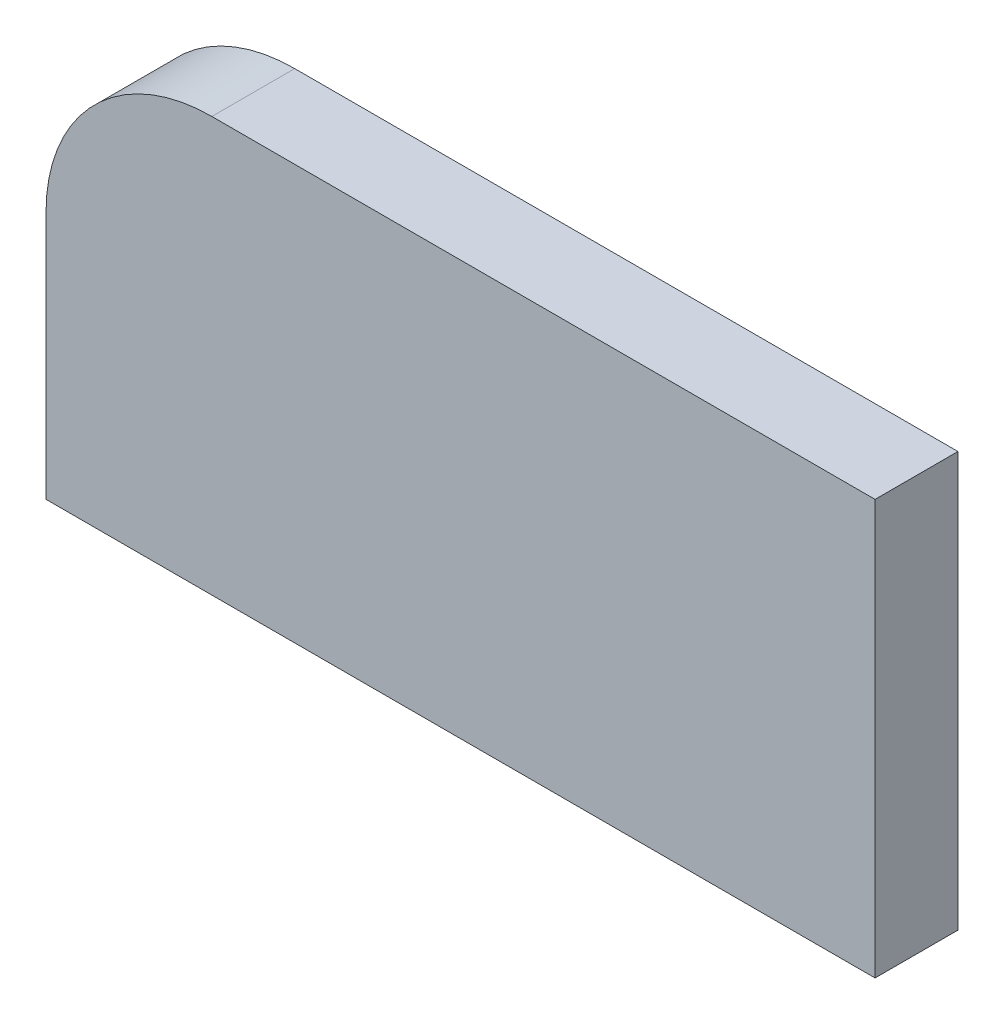
ISO-10303-21;
HEADER;
FILE_DESCRIPTION(('STEP AP214'),'2;1');
FILE_NAME('part.step','',(''),(''),'','','');
FILE_SCHEMA(('AUTOMOTIVE_DESIGN { 1 0 10303 214 1 1 1 1 }'));
ENDSEC;
DATA;
#1=APPLICATION_CONTEXT('core data for automotive mechanical design processes');
#2=APPLICATION_PROTOCOL_DEFINITION('international standard','automotive_design',2000,#1);
#3=PRODUCT_CONTEXT('',#1,'mechanical');
#4=PRODUCT('Part','Part','',(#3));
#5=PRODUCT_RELATED_PRODUCT_CATEGORY('part','',(#4));
#6=PRODUCT_DEFINITION_FORMATION('','',#4);
#7=PRODUCT_DEFINITION_CONTEXT('part definition',#1,'design');
#8=PRODUCT_DEFINITION('design','',#6,#7);
#9=PRODUCT_DEFINITION_SHAPE('','',#8);
#10=(LENGTH_UNIT() NAMED_UNIT(*) SI_UNIT(.MILLI.,.METRE.));
#11=(NAMED_UNIT(*) PLANE_ANGLE_UNIT() SI_UNIT($,.RADIAN.));
#12=(NAMED_UNIT(*) SI_UNIT($,.STERADIAN.) SOLID_ANGLE_UNIT());
#13=UNCERTAINTY_MEASURE_WITH_UNIT(LENGTH_MEASURE(1.E-05),#10,'distance_accuracy_value','');
#14=(GEOMETRIC_REPRESENTATION_CONTEXT(3) GLOBAL_UNCERTAINTY_ASSIGNED_CONTEXT((#13)) GLOBAL_UNIT_ASSIGNED_CONTEXT((#10,
#11,#12)) REPRESENTATION_CONTEXT('',''));
#15=CARTESIAN_POINT('',(0.,0.,0.));
#16=DIRECTION('',(0.,0.,1.));
#17=DIRECTION('',(1.,0.,0.));
#18=AXIS2_PLACEMENT_3D('',#15,#16,#17);
#19=CARTESIAN_POINT('',(29.,12.5,5.));
#20=DIRECTION('',(-1.,0.,0.));
#21=DIRECTION('',(0.,-1.,0.));
#22=AXIS2_PLACEMENT_3D('',#19,#20,#21);
#23=PLANE('',#22);
#24=DIRECTION('',(0.,1.,0.));
#25=VECTOR('',#24,1.);
#26=CARTESIAN_POINT('',(29.,12.5,0.));
#27=LINE('',#26,#25);
#28=CARTESIAN_POINT('',(29.,-12.5,0.));
#29=VERTEX_POINT('',#28);
#30=CARTESIAN_POINT('',(29.,12.5,0.));
#31=VERTEX_POINT('',#30);
#32=EDGE_CURVE('E105',#29,#31,#27,.T.);
#33=ORIENTED_EDGE('',*,*,#32,.T.);
#34=DIRECTION('',(0.,0.,-1.));
#35=VECTOR('',#34,1.);
#36=CARTESIAN_POINT('',(29.,12.5,5.));
#37=LINE('',#36,#35);
#38=CARTESIAN_POINT('',(29.,12.5,5.));
#39=VERTEX_POINT('',#38);
#40=EDGE_CURVE('E11',#39,#31,#37,.T.);
#41=ORIENTED_EDGE('',*,*,#40,.F.);
#42=DIRECTION('',(0.,1.,0.));
#43=VECTOR('',#42,1.);
#44=CARTESIAN_POINT('',(29.,12.5,5.));
#45=LINE('',#44,#43);
#46=CARTESIAN_POINT('',(29.,-12.5,5.));
#47=VERTEX_POINT('',#46);
#48=EDGE_CURVE('E113',#47,#39,#45,.T.);
#49=ORIENTED_EDGE('',*,*,#48,.F.);
#50=DIRECTION('',(0.,0.,-1.));
#51=VECTOR('',#50,1.);
#52=CARTESIAN_POINT('',(29.,-12.5,5.));
#53=LINE('',#52,#51);
#54=EDGE_CURVE('E101',#47,#29,#53,.T.);
#55=ORIENTED_EDGE('',*,*,#54,.T.);
#56=EDGE_LOOP('',(#33,#41,#49,#55));
#57=FACE_BOUND('',#56,.T.);
#58=ADVANCED_FACE('F31',(#57),#23,.F.);
#59=CARTESIAN_POINT('',(29.,12.5,5.));
#60=DIRECTION('',(0.,-1.,0.));
#61=DIRECTION('',(1.,0.,0.));
#62=AXIS2_PLACEMENT_3D('',#59,#60,#61);
#63=PLANE('',#62);
#64=DIRECTION('',(-1.,0.,0.));
#65=VECTOR('',#64,1.);
#66=CARTESIAN_POINT('',(29.,12.5,0.));
#67=LINE('',#66,#65);
#68=CARTESIAN_POINT('',(-11.,12.5,0.));
#69=VERTEX_POINT('',#68);
#70=EDGE_CURVE('E108',#31,#69,#67,.T.);
#71=ORIENTED_EDGE('',*,*,#70,.T.);
#72=DIRECTION('',(0.,0.,-1.));
#73=VECTOR('',#72,1.);
#74=CARTESIAN_POINT('',(-11.,12.5,5.));
#75=LINE('',#74,#73);
#76=CARTESIAN_POINT('',(-11.,12.5,5.));
#77=VERTEX_POINT('',#76);
#78=EDGE_CURVE('E39',#77,#69,#75,.T.);
#79=ORIENTED_EDGE('',*,*,#78,.F.);
#80=DIRECTION('',(-1.,0.,0.));
#81=VECTOR('',#80,1.);
#82=CARTESIAN_POINT('',(29.,12.5,5.));
#83=LINE('',#82,#81);
#84=EDGE_CURVE('E81',#39,#77,#83,.T.);
#85=ORIENTED_EDGE('',*,*,#84,.F.);
#86=ORIENTED_EDGE('',*,*,#40,.T.);
#87=EDGE_LOOP('',(#71,#79,#85,#86));
#88=FACE_BOUND('',#87,.T.);
#89=ADVANCED_FACE('F132',(#88),#63,.F.);
#90=CARTESIAN_POINT('',(-11.,2.5,5.));
#91=DIRECTION('',(0.,0.,-1.));
#92=DIRECTION('',(-1.,0.,0.));
#93=AXIS2_PLACEMENT_3D('',#90,#91,#92);
#94=CYLINDRICAL_SURFACE('',#93,10.);
#95=CARTESIAN_POINT('',(-11.,2.5,0.));
#96=DIRECTION('',(0.,0.,1.));
#97=DIRECTION('',(-1.,0.,0.));
#98=AXIS2_PLACEMENT_3D('',#95,#96,#97);
#99=CIRCLE('',#98,10.);
#100=CARTESIAN_POINT('',(-21.,2.5,0.));
#101=VERTEX_POINT('',#100);
#102=EDGE_CURVE('E96',#69,#101,#99,.T.);
#103=ORIENTED_EDGE('',*,*,#102,.T.);
#104=DIRECTION('',(0.,0.,-1.));
#105=VECTOR('',#104,1.);
#106=CARTESIAN_POINT('',(-21.,2.5,5.));
#107=LINE('',#106,#105);
#108=CARTESIAN_POINT('',(-21.,2.5,5.));
#109=VERTEX_POINT('',#108);
#110=EDGE_CURVE('E93',#109,#101,#107,.T.);
#111=ORIENTED_EDGE('',*,*,#110,.F.);
#112=CARTESIAN_POINT('',(-11.,2.5,5.));
#113=DIRECTION('',(0.,0.,1.));
#114=DIRECTION('',(-1.,0.,0.));
#115=AXIS2_PLACEMENT_3D('',#112,#113,#114);
#116=CIRCLE('',#115,10.);
#117=EDGE_CURVE('E85',#77,#109,#116,.T.);
#118=ORIENTED_EDGE('',*,*,#117,.F.);
#119=ORIENTED_EDGE('',*,*,#78,.T.);
#120=EDGE_LOOP('',(#103,#111,#118,#119));
#121=FACE_BOUND('',#120,.T.);
#122=ADVANCED_FACE('F94',(#121),#94,.T.);
#123=CARTESIAN_POINT('',(-21.,2.5,5.));
#124=DIRECTION('',(1.,0.,0.));
#125=DIRECTION('',(0.,0.,-1.));
#126=AXIS2_PLACEMENT_3D('',#123,#124,#125);
#127=PLANE('',#126);
#128=DIRECTION('',(0.,-1.,0.));
#129=VECTOR('',#128,1.);
#130=CARTESIAN_POINT('',(-21.,2.5,0.));
#131=LINE('',#130,#129);
#132=CARTESIAN_POINT('',(-21.,-12.5,0.));
#133=VERTEX_POINT('',#132);
#134=EDGE_CURVE('E67',#101,#133,#131,.T.);
#135=ORIENTED_EDGE('',*,*,#134,.T.);
#136=DIRECTION('',(0.,0.,-1.));
#137=VECTOR('',#136,1.);
#138=CARTESIAN_POINT('',(-21.,-12.5,5.));
#139=LINE('',#138,#137);
#140=CARTESIAN_POINT('',(-21.,-12.5,5.));
#141=VERTEX_POINT('',#140);
#142=EDGE_CURVE('E97',#141,#133,#139,.T.);
#143=ORIENTED_EDGE('',*,*,#142,.F.);
#144=DIRECTION('',(0.,-1.,0.));
#145=VECTOR('',#144,1.);
#146=CARTESIAN_POINT('',(-21.,2.5,5.));
#147=LINE('',#146,#145);
#148=EDGE_CURVE('E89',#109,#141,#147,.T.);
#149=ORIENTED_EDGE('',*,*,#148,.F.);
#150=ORIENTED_EDGE('',*,*,#110,.T.);
#151=EDGE_LOOP('',(#135,#143,#149,#150));
#152=FACE_BOUND('',#151,.T.);
#153=ADVANCED_FACE('F99',(#152),#127,.F.);
#154=CARTESIAN_POINT('',(29.,-12.5,5.));
#155=DIRECTION('',(0.,1.,0.));
#156=DIRECTION('',(-1.,0.,0.));
#157=AXIS2_PLACEMENT_3D('',#154,#155,#156);
#158=PLANE('',#157);
#159=DIRECTION('',(1.,0.,0.));
#160=VECTOR('',#159,1.);
#161=CARTESIAN_POINT('',(29.,-12.5,0.));
#162=LINE('',#161,#160);
#163=EDGE_CURVE('E73',#133,#29,#162,.T.);
#164=ORIENTED_EDGE('',*,*,#163,.T.);
#165=ORIENTED_EDGE('',*,*,#54,.F.);
#166=DIRECTION('',(1.,0.,0.));
#167=VECTOR('',#166,1.);
#168=CARTESIAN_POINT('',(29.,-12.5,5.));
#169=LINE('',#168,#167);
#170=EDGE_CURVE('E47',#141,#47,#169,.T.);
#171=ORIENTED_EDGE('',*,*,#170,.F.);
#172=ORIENTED_EDGE('',*,*,#142,.T.);
#173=EDGE_LOOP('',(#164,#165,#171,#172));
#174=FACE_BOUND('',#173,.T.);
#175=ADVANCED_FACE('F121',(#174),#158,.F.);
#176=CARTESIAN_POINT('',(-11.,2.5,5.));
#177=DIRECTION('',(0.,0.,-1.));
#178=DIRECTION('',(-1.,0.,0.));
#179=AXIS2_PLACEMENT_3D('',#176,#177,#178);
#180=PLANE('',#179);
#181=ORIENTED_EDGE('',*,*,#48,.T.);
#182=ORIENTED_EDGE('',*,*,#84,.T.);
#183=ORIENTED_EDGE('',*,*,#117,.T.);
#184=ORIENTED_EDGE('',*,*,#148,.T.);
#185=ORIENTED_EDGE('',*,*,#170,.T.);
#186=EDGE_LOOP('',(#181,#182,#183,#184,#185));
#187=FACE_BOUND('',#186,.T.);
#188=ADVANCED_FACE('F87',(#187),#180,.F.);
#189=CARTESIAN_POINT('',(-11.,2.5,0.));
#190=DIRECTION('',(0.,0.,-1.));
#191=DIRECTION('',(-1.,0.,0.));
#192=AXIS2_PLACEMENT_3D('',#189,#190,#191);
#193=PLANE('',#192);
#194=ORIENTED_EDGE('',*,*,#32,.F.);
#195=ORIENTED_EDGE('',*,*,#163,.F.);
#196=ORIENTED_EDGE('',*,*,#134,.F.);
#197=ORIENTED_EDGE('',*,*,#102,.F.);
#198=ORIENTED_EDGE('',*,*,#70,.F.);
#199=EDGE_LOOP('',(#194,#195,#196,#197,#198));
#200=FACE_BOUND('',#199,.T.);
#201=ADVANCED_FACE('F117',(#200),#193,.T.);
#202=CLOSED_SHELL('',(#58,#89,#122,#153,#175,#188,#201));
#203=MANIFOLD_SOLID_BREP('B2',#202);
#204=ADVANCED_BREP_SHAPE_REPRESENTATION('',(#18,#203),#14);
#205=SHAPE_DEFINITION_REPRESENTATION(#9,#204);
ENDSEC;
END-ISO-10303-21;
